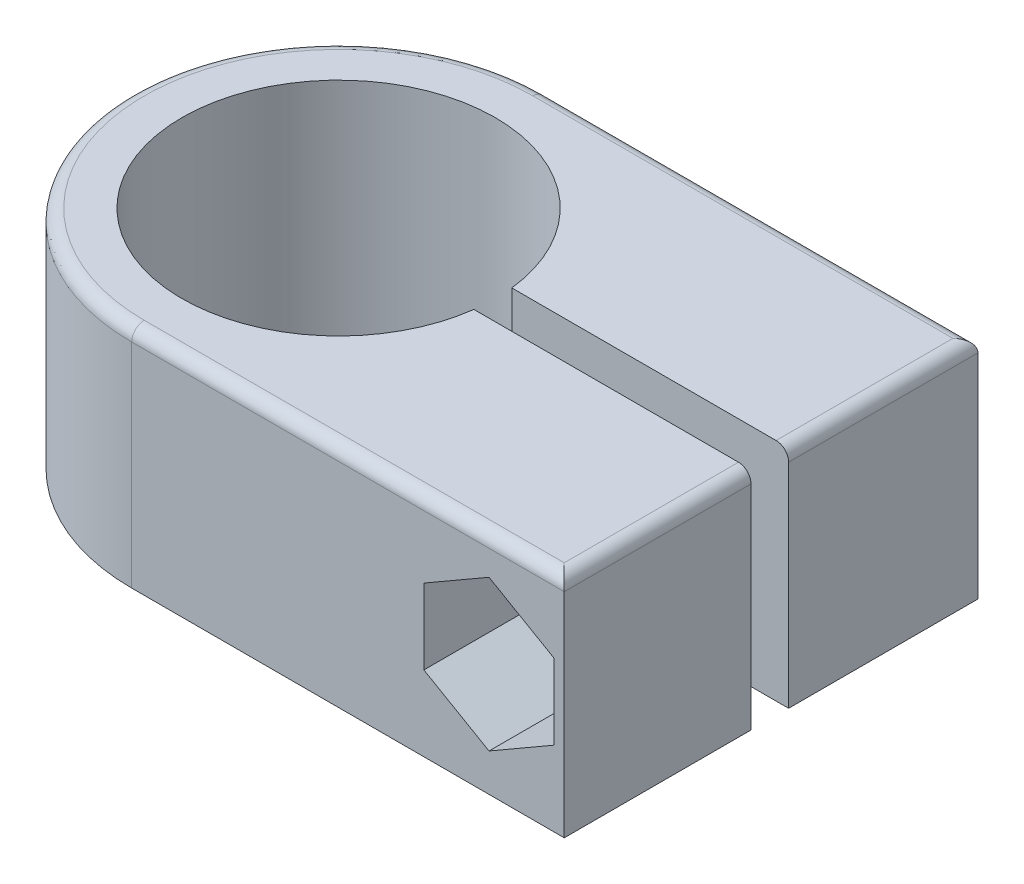
ISO-10303-21;
HEADER;
FILE_DESCRIPTION(('STEP AP214'),'2;1');
FILE_NAME('part.step','',(''),(''),'','','');
FILE_SCHEMA(('AUTOMOTIVE_DESIGN { 1 0 10303 214 1 1 1 1 }'));
ENDSEC;
DATA;
#1=APPLICATION_CONTEXT('core data for automotive mechanical design processes');
#2=APPLICATION_PROTOCOL_DEFINITION('international standard','automotive_design',2000,#1);
#3=PRODUCT_CONTEXT('',#1,'mechanical');
#4=PRODUCT('Part','Part','',(#3));
#5=PRODUCT_RELATED_PRODUCT_CATEGORY('part','',(#4));
#6=PRODUCT_DEFINITION_FORMATION('','',#4);
#7=PRODUCT_DEFINITION_CONTEXT('part definition',#1,'design');
#8=PRODUCT_DEFINITION('design','',#6,#7);
#9=PRODUCT_DEFINITION_SHAPE('','',#8);
#10=(LENGTH_UNIT() NAMED_UNIT(*) SI_UNIT(.MILLI.,.METRE.));
#11=(NAMED_UNIT(*) PLANE_ANGLE_UNIT() SI_UNIT($,.RADIAN.));
#12=(NAMED_UNIT(*) SI_UNIT($,.STERADIAN.) SOLID_ANGLE_UNIT());
#13=UNCERTAINTY_MEASURE_WITH_UNIT(LENGTH_MEASURE(1.E-05),#10,'distance_accuracy_value','');
#14=(GEOMETRIC_REPRESENTATION_CONTEXT(3) GLOBAL_UNCERTAINTY_ASSIGNED_CONTEXT((#13)) GLOBAL_UNIT_ASSIGNED_CONTEXT((#10,
#11,#12)) REPRESENTATION_CONTEXT('',''));
#15=CARTESIAN_POINT('',(0.,0.,0.));
#16=DIRECTION('',(0.,0.,1.));
#17=DIRECTION('',(1.,0.,0.));
#18=AXIS2_PLACEMENT_3D('',#15,#16,#17);
#19=CARTESIAN_POINT('',(0.,18.,16.5));
#20=DIRECTION('',(0.,0.,-1.));
#21=DIRECTION('',(-1.,0.,0.));
#22=AXIS2_PLACEMENT_3D('',#19,#20,#21);
#23=PLANE('',#22);
#24=DIRECTION('',(0.,-1.,0.));
#25=VECTOR('',#24,1.);
#26=CARTESIAN_POINT('',(34.5,18.,16.5));
#27=LINE('',#26,#25);
#28=CARTESIAN_POINT('',(34.5,17.,16.5));
#29=VERTEX_POINT('',#28);
#30=CARTESIAN_POINT('',(34.5,0.,16.5));
#31=VERTEX_POINT('',#30);
#32=EDGE_CURVE('E300',#29,#31,#27,.T.);
#33=ORIENTED_EDGE('',*,*,#32,.F.);
#34=DIRECTION('',(1.,0.,0.));
#35=VECTOR('',#34,1.);
#36=CARTESIAN_POINT('',(0.,17.,16.5));
#37=LINE('',#36,#35);
#38=CARTESIAN_POINT('',(0.,17.,16.5));
#39=VERTEX_POINT('',#38);
#40=EDGE_CURVE('E336',#29,#39,#37,.F.);
#41=ORIENTED_EDGE('',*,*,#40,.T.);
#42=DIRECTION('',(0.,-1.,0.));
#43=VECTOR('',#42,1.);
#44=CARTESIAN_POINT('',(0.,18.,16.5));
#45=LINE('',#44,#43);
#46=CARTESIAN_POINT('',(0.,0.,16.5));
#47=VERTEX_POINT('',#46);
#48=EDGE_CURVE('E302',#39,#47,#45,.T.);
#49=ORIENTED_EDGE('',*,*,#48,.T.);
#50=DIRECTION('',(1.,0.,0.));
#51=VECTOR('',#50,1.);
#52=CARTESIAN_POINT('',(0.,0.,16.5));
#53=LINE('',#52,#51);
#54=EDGE_CURVE('E284',#47,#31,#53,.T.);
#55=ORIENTED_EDGE('',*,*,#54,.T.);
#56=EDGE_LOOP('',(#33,#41,#49,#55));
#57=FACE_BOUND('',#56,.T.);
#58=DIRECTION('',(-0.866025403784438,0.5,0.));
#59=VECTOR('',#58,1.);
#60=CARTESIAN_POINT('',(5.82596189432337,28.0908620039283,16.5));
#61=LINE('',#60,#59);
#62=CARTESIAN_POINT('',(33.6961524227067,12.,16.5));
#63=VERTEX_POINT('',#62);
#64=CARTESIAN_POINT('',(28.5,15.,16.5));
#65=VERTEX_POINT('',#64);
#66=EDGE_CURVE('E363',#63,#65,#61,.T.);
#67=ORIENTED_EDGE('',*,*,#66,.F.);
#68=DIRECTION('',(0.,1.,0.));
#69=VECTOR('',#68,1.);
#70=CARTESIAN_POINT('',(33.6961524227067,18.,16.5));
#71=LINE('',#70,#69);
#72=CARTESIAN_POINT('',(33.6961524227067,5.99999999999997,16.5));
#73=VERTEX_POINT('',#72);
#74=EDGE_CURVE('E353',#73,#63,#71,.T.);
#75=ORIENTED_EDGE('',*,*,#74,.F.);
#76=DIRECTION('',(0.866025403784438,0.5,0.));
#77=VECTOR('',#76,1.);
#78=CARTESIAN_POINT('',(13.6201905283833,-5.59086200392829,16.5));
#79=LINE('',#78,#77);
#80=CARTESIAN_POINT('',(28.5,2.99999999999995,16.5));
#81=VERTEX_POINT('',#80);
#82=EDGE_CURVE('E355',#81,#73,#79,.T.);
#83=ORIENTED_EDGE('',*,*,#82,.F.);
#84=DIRECTION('',(0.866025403784439,-0.5,0.));
#85=VECTOR('',#84,1.);
#86=CARTESIAN_POINT('',(0.629809471616695,19.0908620039282,16.5));
#87=LINE('',#86,#85);
#88=CARTESIAN_POINT('',(23.3038475772933,5.99999999999998,16.5));
#89=VERTEX_POINT('',#88);
#90=EDGE_CURVE('E357',#89,#81,#87,.T.);
#91=ORIENTED_EDGE('',*,*,#90,.F.);
#92=DIRECTION('',(0.,-1.,0.));
#93=VECTOR('',#92,1.);
#94=CARTESIAN_POINT('',(23.3038475772933,18.,16.5));
#95=LINE('',#94,#93);
#96=CARTESIAN_POINT('',(23.3038475772933,12.,16.5));
#97=VERTEX_POINT('',#96);
#98=EDGE_CURVE('E359',#97,#89,#95,.T.);
#99=ORIENTED_EDGE('',*,*,#98,.F.);
#100=DIRECTION('',(-0.866025403784438,-0.5,0.));
#101=VECTOR('',#100,1.);
#102=CARTESIAN_POINT('',(8.42403810567665,3.40913799607178,16.5));
#103=LINE('',#102,#101);
#104=EDGE_CURVE('E361',#65,#97,#103,.T.);
#105=ORIENTED_EDGE('',*,*,#104,.F.);
#106=EDGE_LOOP('',(#67,#75,#83,#91,#99,#105));
#107=FACE_BOUND('',#106,.T.);
#108=ADVANCED_FACE('F38',(#57,#107),#23,.F.);
#109=CARTESIAN_POINT('',(0.,17.,15.5));
#110=DIRECTION('',(-1.,0.,0.));
#111=DIRECTION('',(0.,0.,1.));
#112=AXIS2_PLACEMENT_3D('',#109,#110,#111);
#113=CYLINDRICAL_SURFACE('',#112,1.);
#114=CARTESIAN_POINT('',(33.5,17.,15.5));
#115=DIRECTION('',(-0.707106781186547,0.,0.707106781186548));
#116=DIRECTION('',(0.707106781186548,0.,0.707106781186547));
#117=AXIS2_PLACEMENT_3D('',#114,#115,#116);
#118=ELLIPSE('',#117,1.41421356237309,1.);
#119=CARTESIAN_POINT('',(33.5,18.,15.5));
#120=VERTEX_POINT('',#119);
#121=EDGE_CURVE('E351',#120,#29,#118,.F.);
#122=ORIENTED_EDGE('',*,*,#121,.F.);
#123=DIRECTION('',(1.,0.,0.));
#124=VECTOR('',#123,1.);
#125=CARTESIAN_POINT('',(0.,18.,15.5));
#126=LINE('',#125,#124);
#127=CARTESIAN_POINT('',(0.,18.,15.5));
#128=VERTEX_POINT('',#127);
#129=EDGE_CURVE('E313',#128,#120,#126,.T.);
#130=ORIENTED_EDGE('',*,*,#129,.F.);
#131=CARTESIAN_POINT('',(0.,17.,15.5));
#132=DIRECTION('',(1.,0.,0.));
#133=DIRECTION('',(0.,0.,-1.));
#134=AXIS2_PLACEMENT_3D('',#131,#132,#133);
#135=CIRCLE('',#134,1.);
#136=EDGE_CURVE('E349',#128,#39,#135,.T.);
#137=ORIENTED_EDGE('',*,*,#136,.T.);
#138=ORIENTED_EDGE('',*,*,#40,.F.);
#139=EDGE_LOOP('',(#122,#130,#137,#138));
#140=FACE_BOUND('',#139,.T.);
#141=ADVANCED_FACE('F398',(#140),#113,.T.);
#142=CARTESIAN_POINT('',(0.,17.,0.));
#143=DIRECTION('',(0.,1.,0.));
#144=DIRECTION('',(0.,0.,1.));
#145=AXIS2_PLACEMENT_3D('',#142,#143,#144);
#146=TOROIDAL_SURFACE('',#145,15.5,1.);
#147=ORIENTED_EDGE('',*,*,#136,.F.);
#148=CARTESIAN_POINT('',(0.,18.,0.));
#149=DIRECTION('',(0.,1.,0.));
#150=DIRECTION('',(0.,0.,1.));
#151=AXIS2_PLACEMENT_3D('',#148,#149,#150);
#152=CIRCLE('',#151,15.5);
#153=CARTESIAN_POINT('',(0.,18.,-15.5));
#154=VERTEX_POINT('',#153);
#155=EDGE_CURVE('E316',#154,#128,#152,.T.);
#156=ORIENTED_EDGE('',*,*,#155,.F.);
#157=CARTESIAN_POINT('',(0.,17.,-15.5));
#158=DIRECTION('',(-1.,0.,0.));
#159=DIRECTION('',(0.,0.,1.));
#160=AXIS2_PLACEMENT_3D('',#157,#158,#159);
#161=CIRCLE('',#160,1.);
#162=CARTESIAN_POINT('',(0.,17.,-16.5));
#163=VERTEX_POINT('',#162);
#164=EDGE_CURVE('E347',#154,#163,#161,.T.);
#165=ORIENTED_EDGE('',*,*,#164,.T.);
#166=CARTESIAN_POINT('',(0.,17.,0.));
#167=DIRECTION('',(0.,1.,0.));
#168=DIRECTION('',(0.,0.,1.));
#169=AXIS2_PLACEMENT_3D('',#166,#167,#168);
#170=CIRCLE('',#169,16.5);
#171=EDGE_CURVE('E333',#39,#163,#170,.F.);
#172=ORIENTED_EDGE('',*,*,#171,.F.);
#173=EDGE_LOOP('',(#147,#156,#165,#172));
#174=FACE_BOUND('',#173,.T.);
#175=ADVANCED_FACE('F404',(#174),#146,.T.);
#176=CARTESIAN_POINT('',(0.,17.,-15.5));
#177=DIRECTION('',(1.,0.,0.));
#178=DIRECTION('',(0.,0.,-1.));
#179=AXIS2_PLACEMENT_3D('',#176,#177,#178);
#180=CYLINDRICAL_SURFACE('',#179,1.);
#181=ORIENTED_EDGE('',*,*,#164,.F.);
#182=DIRECTION('',(-1.,0.,0.));
#183=VECTOR('',#182,1.);
#184=CARTESIAN_POINT('',(0.,18.,-15.5));
#185=LINE('',#184,#183);
#186=CARTESIAN_POINT('',(33.5,18.,-15.5));
#187=VERTEX_POINT('',#186);
#188=EDGE_CURVE('E319',#187,#154,#185,.T.);
#189=ORIENTED_EDGE('',*,*,#188,.F.);
#190=CARTESIAN_POINT('',(33.5,17.,-15.5));
#191=DIRECTION('',(0.707106781186547,0.,0.707106781186548));
#192=DIRECTION('',(0.707106781186548,0.,-0.707106781186547));
#193=AXIS2_PLACEMENT_3D('',#190,#191,#192);
#194=ELLIPSE('',#193,1.41421356237309,1.);
#195=CARTESIAN_POINT('',(34.5,17.,-16.5));
#196=VERTEX_POINT('',#195);
#197=EDGE_CURVE('E345',#187,#196,#194,.F.);
#198=ORIENTED_EDGE('',*,*,#197,.T.);
#199=DIRECTION('',(-1.,0.,0.));
#200=VECTOR('',#199,1.);
#201=CARTESIAN_POINT('',(0.,17.,-16.5));
#202=LINE('',#201,#200);
#203=EDGE_CURVE('E330',#163,#196,#202,.F.);
#204=ORIENTED_EDGE('',*,*,#203,.F.);
#205=EDGE_LOOP('',(#181,#189,#198,#204));
#206=FACE_BOUND('',#205,.T.);
#207=ADVANCED_FACE('F429',(#206),#180,.T.);
#208=CARTESIAN_POINT('',(33.5,17.,0.));
#209=DIRECTION('',(0.,0.,1.));
#210=DIRECTION('',(1.,0.,0.));
#211=AXIS2_PLACEMENT_3D('',#208,#209,#210);
#212=CYLINDRICAL_SURFACE('',#211,1.);
#213=ORIENTED_EDGE('',*,*,#197,.F.);
#214=DIRECTION('',(0.,0.,-1.));
#215=VECTOR('',#214,1.);
#216=CARTESIAN_POINT('',(33.5,18.,0.));
#217=LINE('',#216,#215);
#218=CARTESIAN_POINT('',(33.5,18.,-1.39445960097202));
#219=VERTEX_POINT('',#218);
#220=EDGE_CURVE('E322',#219,#187,#217,.T.);
#221=ORIENTED_EDGE('',*,*,#220,.F.);
#222=CARTESIAN_POINT('',(33.5,17.,-1.39445960097202));
#223=DIRECTION('',(0.,0.,-1.));
#224=DIRECTION('',(-1.,0.,0.));
#225=AXIS2_PLACEMENT_3D('',#222,#223,#224);
#226=CIRCLE('',#225,1.);
#227=CARTESIAN_POINT('',(34.5,17.,-1.39445960097202));
#228=VERTEX_POINT('',#227);
#229=EDGE_CURVE('E328',#228,#219,#226,.F.);
#230=ORIENTED_EDGE('',*,*,#229,.F.);
#231=DIRECTION('',(0.,0.,-1.));
#232=VECTOR('',#231,1.);
#233=CARTESIAN_POINT('',(34.5,17.,0.));
#234=LINE('',#233,#232);
#235=EDGE_CURVE('E325',#196,#228,#234,.F.);
#236=ORIENTED_EDGE('',*,*,#235,.F.);
#237=EDGE_LOOP('',(#213,#221,#230,#236));
#238=FACE_BOUND('',#237,.T.);
#239=ADVANCED_FACE('F426',(#238),#212,.T.);
#240=CARTESIAN_POINT('',(33.5,17.,0.));
#241=DIRECTION('',(0.,0.,1.));
#242=DIRECTION('',(1.,0.,0.));
#243=AXIS2_PLACEMENT_3D('',#240,#241,#242);
#244=CYLINDRICAL_SURFACE('',#243,1.);
#245=DIRECTION('',(0.,0.,-1.));
#246=VECTOR('',#245,1.);
#247=CARTESIAN_POINT('',(33.5,18.,0.));
#248=LINE('',#247,#246);
#249=CARTESIAN_POINT('',(33.5,18.,1.60554039902798));
#250=VERTEX_POINT('',#249);
#251=EDGE_CURVE('E310',#120,#250,#248,.T.);
#252=ORIENTED_EDGE('',*,*,#251,.F.);
#253=ORIENTED_EDGE('',*,*,#121,.T.);
#254=DIRECTION('',(0.,0.,-1.));
#255=VECTOR('',#254,1.);
#256=CARTESIAN_POINT('',(34.5,17.,0.));
#257=LINE('',#256,#255);
#258=CARTESIAN_POINT('',(34.5,17.,1.60554039902798));
#259=VERTEX_POINT('',#258);
#260=EDGE_CURVE('E342',#259,#29,#257,.F.);
#261=ORIENTED_EDGE('',*,*,#260,.F.);
#262=CARTESIAN_POINT('',(33.5,17.,1.60554039902798));
#263=DIRECTION('',(0.,0.,1.));
#264=DIRECTION('',(1.,0.,0.));
#265=AXIS2_PLACEMENT_3D('',#262,#263,#264);
#266=CIRCLE('',#265,1.);
#267=EDGE_CURVE('E339',#250,#259,#266,.F.);
#268=ORIENTED_EDGE('',*,*,#267,.F.);
#269=EDGE_LOOP('',(#252,#253,#261,#268));
#270=FACE_BOUND('',#269,.T.);
#271=ADVANCED_FACE('F40',(#270),#244,.T.);
#272=CARTESIAN_POINT('',(12.4219757857298,18.,-1.39445960097202));
#273=DIRECTION('',(0.,0.,-1.));
#274=DIRECTION('',(-1.,0.,0.));
#275=AXIS2_PLACEMENT_3D('',#272,#273,#274);
#276=PLANE('',#275);
#277=DIRECTION('',(0.,-1.,0.));
#278=VECTOR('',#277,1.);
#279=CARTESIAN_POINT('',(34.5,18.,-1.39445960097202));
#280=LINE('',#279,#278);
#281=CARTESIAN_POINT('',(34.5,0.,-1.39445960097202));
#282=VERTEX_POINT('',#281);
#283=EDGE_CURVE('E308',#228,#282,#280,.T.);
#284=ORIENTED_EDGE('',*,*,#283,.F.);
#285=ORIENTED_EDGE('',*,*,#229,.T.);
#286=DIRECTION('',(1.,0.,0.));
#287=VECTOR('',#286,1.);
#288=CARTESIAN_POINT('',(12.4219757857298,18.,-1.39445960097202));
#289=LINE('',#288,#287);
#290=CARTESIAN_POINT('',(12.4219757857298,18.,-1.39445960097202));
#291=VERTEX_POINT('',#290);
#292=EDGE_CURVE('E264',#291,#219,#289,.T.);
#293=ORIENTED_EDGE('',*,*,#292,.F.);
#294=DIRECTION('',(0.,-1.,0.));
#295=VECTOR('',#294,1.);
#296=CARTESIAN_POINT('',(12.4219757857298,18.,-1.39445960097202));
#297=LINE('',#296,#295);
#298=CARTESIAN_POINT('',(12.4219757857298,0.,-1.39445960097202));
#299=VERTEX_POINT('',#298);
#300=EDGE_CURVE('E272',#291,#299,#297,.T.);
#301=ORIENTED_EDGE('',*,*,#300,.T.);
#302=DIRECTION('',(1.,0.,0.));
#303=VECTOR('',#302,1.);
#304=CARTESIAN_POINT('',(12.4219757857298,0.,-1.39445960097202));
#305=LINE('',#304,#303);
#306=EDGE_CURVE('E263',#299,#282,#305,.T.);
#307=ORIENTED_EDGE('',*,*,#306,.T.);
#308=EDGE_LOOP('',(#284,#285,#293,#301,#307));
#309=FACE_BOUND('',#308,.T.);
#310=ADVANCED_FACE('F421',(#309),#276,.F.);
#311=CARTESIAN_POINT('',(34.5,18.,-1.39445960097202));
#312=DIRECTION('',(-1.,0.,0.));
#313=DIRECTION('',(0.,0.,1.));
#314=AXIS2_PLACEMENT_3D('',#311,#312,#313);
#315=PLANE('',#314);
#316=DIRECTION('',(0.,-1.,0.));
#317=VECTOR('',#316,1.);
#318=CARTESIAN_POINT('',(34.5,18.,-16.5));
#319=LINE('',#318,#317);
#320=CARTESIAN_POINT('',(34.5,0.,-16.5));
#321=VERTEX_POINT('',#320);
#322=EDGE_CURVE('E306',#196,#321,#319,.T.);
#323=ORIENTED_EDGE('',*,*,#322,.F.);
#324=ORIENTED_EDGE('',*,*,#235,.T.);
#325=ORIENTED_EDGE('',*,*,#283,.T.);
#326=DIRECTION('',(0.,0.,-1.));
#327=VECTOR('',#326,1.);
#328=CARTESIAN_POINT('',(34.5,0.,-1.39445960097202));
#329=LINE('',#328,#327);
#330=EDGE_CURVE('E275',#282,#321,#329,.T.);
#331=ORIENTED_EDGE('',*,*,#330,.T.);
#332=EDGE_LOOP('',(#323,#324,#325,#331));
#333=FACE_BOUND('',#332,.T.);
#334=ADVANCED_FACE('F418',(#333),#315,.F.);
#335=CARTESIAN_POINT('',(0.,18.,-16.5));
#336=DIRECTION('',(0.,0.,1.));
#337=DIRECTION('',(1.,0.,0.));
#338=AXIS2_PLACEMENT_3D('',#335,#336,#337);
#339=PLANE('',#338);
#340=DIRECTION('',(0.,1.,0.));
#341=VECTOR('',#340,1.);
#342=CARTESIAN_POINT('',(33.6961524227067,18.,-16.5));
#343=LINE('',#342,#341);
#344=CARTESIAN_POINT('',(33.6961524227067,5.99999999999997,-16.5));
#345=VERTEX_POINT('',#344);
#346=CARTESIAN_POINT('',(33.6961524227067,12.,-16.5));
#347=VERTEX_POINT('',#346);
#348=EDGE_CURVE('E46',#345,#347,#343,.T.);
#349=ORIENTED_EDGE('',*,*,#348,.T.);
#350=DIRECTION('',(-0.866025403784438,0.5,0.));
#351=VECTOR('',#350,1.);
#352=CARTESIAN_POINT('',(5.82596189432337,28.0908620039283,-16.5));
#353=LINE('',#352,#351);
#354=CARTESIAN_POINT('',(28.5,15.,-16.5));
#355=VERTEX_POINT('',#354);
#356=EDGE_CURVE('E11',#347,#355,#353,.T.);
#357=ORIENTED_EDGE('',*,*,#356,.T.);
#358=DIRECTION('',(-0.866025403784438,-0.5,0.));
#359=VECTOR('',#358,1.);
#360=CARTESIAN_POINT('',(8.42403810567665,3.40913799607178,-16.5));
#361=LINE('',#360,#359);
#362=CARTESIAN_POINT('',(23.3038475772933,12.,-16.5));
#363=VERTEX_POINT('',#362);
#364=EDGE_CURVE('E365',#355,#363,#361,.T.);
#365=ORIENTED_EDGE('',*,*,#364,.T.);
#366=DIRECTION('',(0.,-1.,0.));
#367=VECTOR('',#366,1.);
#368=CARTESIAN_POINT('',(23.3038475772933,18.,-16.5));
#369=LINE('',#368,#367);
#370=CARTESIAN_POINT('',(23.3038475772933,5.99999999999998,-16.5));
#371=VERTEX_POINT('',#370);
#372=EDGE_CURVE('E368',#363,#371,#369,.T.);
#373=ORIENTED_EDGE('',*,*,#372,.T.);
#374=DIRECTION('',(0.866025403784439,-0.5,0.));
#375=VECTOR('',#374,1.);
#376=CARTESIAN_POINT('',(0.629809471616695,19.0908620039282,-16.5));
#377=LINE('',#376,#375);
#378=CARTESIAN_POINT('',(28.5,2.99999999999995,-16.5));
#379=VERTEX_POINT('',#378);
#380=EDGE_CURVE('E371',#371,#379,#377,.T.);
#381=ORIENTED_EDGE('',*,*,#380,.T.);
#382=DIRECTION('',(0.866025403784438,0.5,0.));
#383=VECTOR('',#382,1.);
#384=CARTESIAN_POINT('',(13.6201905283833,-5.59086200392829,-16.5));
#385=LINE('',#384,#383);
#386=EDGE_CURVE('E374',#379,#345,#385,.T.);
#387=ORIENTED_EDGE('',*,*,#386,.T.);
#388=EDGE_LOOP('',(#349,#357,#365,#373,#381,#387));
#389=FACE_BOUND('',#388,.T.);
#390=DIRECTION('',(0.,-1.,0.));
#391=VECTOR('',#390,1.);
#392=CARTESIAN_POINT('',(0.,18.,-16.5));
#393=LINE('',#392,#391);
#394=CARTESIAN_POINT('',(0.,0.,-16.5));
#395=VERTEX_POINT('',#394);
#396=EDGE_CURVE('E304',#163,#395,#393,.T.);
#397=ORIENTED_EDGE('',*,*,#396,.F.);
#398=ORIENTED_EDGE('',*,*,#203,.T.);
#399=ORIENTED_EDGE('',*,*,#322,.T.);
#400=DIRECTION('',(-1.,0.,0.));
#401=VECTOR('',#400,1.);
#402=CARTESIAN_POINT('',(0.,0.,-16.5));
#403=LINE('',#402,#401);
#404=EDGE_CURVE('E278',#321,#395,#403,.T.);
#405=ORIENTED_EDGE('',*,*,#404,.T.);
#406=EDGE_LOOP('',(#397,#398,#399,#405));
#407=FACE_BOUND('',#406,.T.);
#408=ADVANCED_FACE('F377',(#389,#407),#339,.F.);
#409=CARTESIAN_POINT('',(0.,18.,0.));
#410=DIRECTION('',(0.,-1.,0.));
#411=DIRECTION('',(0.,0.,-1.));
#412=AXIS2_PLACEMENT_3D('',#409,#410,#411);
#413=CYLINDRICAL_SURFACE('',#412,16.5);
#414=ORIENTED_EDGE('',*,*,#48,.F.);
#415=ORIENTED_EDGE('',*,*,#171,.T.);
#416=ORIENTED_EDGE('',*,*,#396,.T.);
#417=CARTESIAN_POINT('',(0.,0.,0.));
#418=DIRECTION('',(0.,1.,0.));
#419=DIRECTION('',(0.,0.,1.));
#420=AXIS2_PLACEMENT_3D('',#417,#418,#419);
#421=CIRCLE('',#420,16.5);
#422=EDGE_CURVE('E281',#395,#47,#421,.T.);
#423=ORIENTED_EDGE('',*,*,#422,.T.);
#424=EDGE_LOOP('',(#414,#415,#416,#423));
#425=FACE_BOUND('',#424,.T.);
#426=ADVANCED_FACE('F412',(#425),#413,.T.);
#427=CARTESIAN_POINT('',(34.5,18.,16.5));
#428=DIRECTION('',(-1.,0.,0.));
#429=DIRECTION('',(0.,0.,1.));
#430=AXIS2_PLACEMENT_3D('',#427,#428,#429);
#431=PLANE('',#430);
#432=DIRECTION('',(0.,-1.,0.));
#433=VECTOR('',#432,1.);
#434=CARTESIAN_POINT('',(34.5,18.,1.60554039902798));
#435=LINE('',#434,#433);
#436=CARTESIAN_POINT('',(34.5,0.,1.60554039902798));
#437=VERTEX_POINT('',#436);
#438=EDGE_CURVE('E298',#259,#437,#435,.T.);
#439=ORIENTED_EDGE('',*,*,#438,.F.);
#440=ORIENTED_EDGE('',*,*,#260,.T.);
#441=ORIENTED_EDGE('',*,*,#32,.T.);
#442=DIRECTION('',(0.,0.,-1.));
#443=VECTOR('',#442,1.);
#444=CARTESIAN_POINT('',(34.5,0.,16.5));
#445=LINE('',#444,#443);
#446=EDGE_CURVE('E287',#31,#437,#445,.T.);
#447=ORIENTED_EDGE('',*,*,#446,.T.);
#448=EDGE_LOOP('',(#439,#440,#441,#447));
#449=FACE_BOUND('',#448,.T.);
#450=ADVANCED_FACE('F410',(#449),#431,.F.);
#451=CARTESIAN_POINT('',(12.3964607863329,18.,1.60554039902798));
#452=DIRECTION('',(0.,0.,1.));
#453=DIRECTION('',(1.,0.,0.));
#454=AXIS2_PLACEMENT_3D('',#451,#452,#453);
#455=PLANE('',#454);
#456=DIRECTION('',(-1.,0.,0.));
#457=VECTOR('',#456,1.);
#458=CARTESIAN_POINT('',(12.3964607863329,18.,1.60554039902798));
#459=LINE('',#458,#457);
#460=CARTESIAN_POINT('',(12.3964607863329,18.,1.60554039902798));
#461=VERTEX_POINT('',#460);
#462=EDGE_CURVE('E267',#250,#461,#459,.T.);
#463=ORIENTED_EDGE('',*,*,#462,.F.);
#464=ORIENTED_EDGE('',*,*,#267,.T.);
#465=ORIENTED_EDGE('',*,*,#438,.T.);
#466=DIRECTION('',(-1.,0.,0.));
#467=VECTOR('',#466,1.);
#468=CARTESIAN_POINT('',(12.3964607863329,0.,1.60554039902798));
#469=LINE('',#468,#467);
#470=CARTESIAN_POINT('',(12.3964607863329,0.,1.60554039902798));
#471=VERTEX_POINT('',#470);
#472=EDGE_CURVE('E290',#437,#471,#469,.T.);
#473=ORIENTED_EDGE('',*,*,#472,.T.);
#474=DIRECTION('',(0.,-1.,0.));
#475=VECTOR('',#474,1.);
#476=CARTESIAN_POINT('',(12.3964607863329,18.,1.60554039902798));
#477=LINE('',#476,#475);
#478=EDGE_CURVE('E295',#461,#471,#477,.T.);
#479=ORIENTED_EDGE('',*,*,#478,.F.);
#480=EDGE_LOOP('',(#463,#464,#465,#473,#479));
#481=FACE_BOUND('',#480,.T.);
#482=ADVANCED_FACE('F454',(#481),#455,.F.);
#483=CARTESIAN_POINT('',(0.,18.,0.));
#484=DIRECTION('',(0.,-1.,0.));
#485=DIRECTION('',(0.,0.,-1.));
#486=AXIS2_PLACEMENT_3D('',#483,#484,#485);
#487=CYLINDRICAL_SURFACE('',#486,12.5);
#488=CARTESIAN_POINT('',(0.,0.,0.));
#489=DIRECTION('',(0.,-1.,0.));
#490=DIRECTION('',(0.,0.,1.));
#491=AXIS2_PLACEMENT_3D('',#488,#489,#490);
#492=CIRCLE('',#491,12.5);
#493=EDGE_CURVE('E268',#471,#299,#492,.T.);
#494=ORIENTED_EDGE('',*,*,#493,.T.);
#495=ORIENTED_EDGE('',*,*,#300,.F.);
#496=CARTESIAN_POINT('',(0.,18.,0.));
#497=DIRECTION('',(0.,-1.,0.));
#498=DIRECTION('',(0.,0.,1.));
#499=AXIS2_PLACEMENT_3D('',#496,#497,#498);
#500=CIRCLE('',#499,12.5);
#501=EDGE_CURVE('E270',#461,#291,#500,.T.);
#502=ORIENTED_EDGE('',*,*,#501,.F.);
#503=ORIENTED_EDGE('',*,*,#478,.T.);
#504=EDGE_LOOP('',(#494,#495,#502,#503));
#505=FACE_BOUND('',#504,.T.);
#506=ADVANCED_FACE('F460',(#505),#487,.F.);
#507=CARTESIAN_POINT('',(0.,18.,0.));
#508=DIRECTION('',(0.,1.,0.));
#509=DIRECTION('',(0.,0.,1.));
#510=AXIS2_PLACEMENT_3D('',#507,#508,#509);
#511=PLANE('',#510);
#512=ORIENTED_EDGE('',*,*,#292,.T.);
#513=ORIENTED_EDGE('',*,*,#220,.T.);
#514=ORIENTED_EDGE('',*,*,#188,.T.);
#515=ORIENTED_EDGE('',*,*,#155,.T.);
#516=ORIENTED_EDGE('',*,*,#129,.T.);
#517=ORIENTED_EDGE('',*,*,#251,.T.);
#518=ORIENTED_EDGE('',*,*,#462,.T.);
#519=ORIENTED_EDGE('',*,*,#501,.T.);
#520=EDGE_LOOP('',(#512,#513,#514,#515,#516,#517,#518,#519));
#521=FACE_BOUND('',#520,.T.);
#522=ADVANCED_FACE('F444',(#521),#511,.T.);
#523=CARTESIAN_POINT('',(0.,0.,0.));
#524=DIRECTION('',(0.,1.,0.));
#525=DIRECTION('',(0.,0.,1.));
#526=AXIS2_PLACEMENT_3D('',#523,#524,#525);
#527=PLANE('',#526);
#528=ORIENTED_EDGE('',*,*,#306,.F.);
#529=ORIENTED_EDGE('',*,*,#493,.F.);
#530=ORIENTED_EDGE('',*,*,#472,.F.);
#531=ORIENTED_EDGE('',*,*,#446,.F.);
#532=ORIENTED_EDGE('',*,*,#54,.F.);
#533=ORIENTED_EDGE('',*,*,#422,.F.);
#534=ORIENTED_EDGE('',*,*,#404,.F.);
#535=ORIENTED_EDGE('',*,*,#330,.F.);
#536=EDGE_LOOP('',(#528,#529,#530,#531,#532,#533,#534,#535));
#537=FACE_BOUND('',#536,.T.);
#538=ADVANCED_FACE('F470',(#537),#527,.F.);
#539=CARTESIAN_POINT('',(33.6961524227067,12.,16.500012));
#540=DIRECTION('',(-0.5,-0.866025403784438,0.));
#541=DIRECTION('',(0.866025403784438,-0.5,0.));
#542=AXIS2_PLACEMENT_3D('',#539,#540,#541);
#543=PLANE('',#542);
#544=ORIENTED_EDGE('',*,*,#66,.T.);
#545=DIRECTION('',(0.,0.,-1.));
#546=VECTOR('',#545,1.);
#547=CARTESIAN_POINT('',(28.5,15.,16.500012));
#548=LINE('',#547,#546);
#549=CARTESIAN_POINT('',(28.5,15.,6.5));
#550=VERTEX_POINT('',#549);
#551=EDGE_CURVE('E261',#65,#550,#548,.T.);
#552=ORIENTED_EDGE('',*,*,#551,.T.);
#553=DIRECTION('',(-0.866025403784438,0.5,0.));
#554=VECTOR('',#553,1.);
#555=CARTESIAN_POINT('',(33.6961524227067,12.,6.5));
#556=LINE('',#555,#554);
#557=CARTESIAN_POINT('',(33.6961524227067,12.,6.5));
#558=VERTEX_POINT('',#557);
#559=EDGE_CURVE('E201',#558,#550,#556,.T.);
#560=ORIENTED_EDGE('',*,*,#559,.F.);
#561=DIRECTION('',(0.,0.,-1.));
#562=VECTOR('',#561,1.);
#563=CARTESIAN_POINT('',(33.6961524227067,12.,16.500012));
#564=LINE('',#563,#562);
#565=EDGE_CURVE('E252',#63,#558,#564,.T.);
#566=ORIENTED_EDGE('',*,*,#565,.F.);
#567=EDGE_LOOP('',(#544,#552,#560,#566));
#568=FACE_BOUND('',#567,.T.);
#569=ADVANCED_FACE('F476',(#568),#543,.T.);
#570=CARTESIAN_POINT('',(28.5,15.,16.500012));
#571=DIRECTION('',(0.5,-0.866025403784438,0.));
#572=DIRECTION('',(0.866025403784438,0.5,0.));
#573=AXIS2_PLACEMENT_3D('',#570,#571,#572);
#574=PLANE('',#573);
#575=ORIENTED_EDGE('',*,*,#104,.T.);
#576=DIRECTION('',(0.,0.,-1.));
#577=VECTOR('',#576,1.);
#578=CARTESIAN_POINT('',(23.3038475772933,12.,16.500012));
#579=LINE('',#578,#577);
#580=CARTESIAN_POINT('',(23.3038475772933,12.,6.5));
#581=VERTEX_POINT('',#580);
#582=EDGE_CURVE('E259',#97,#581,#579,.T.);
#583=ORIENTED_EDGE('',*,*,#582,.T.);
#584=DIRECTION('',(-0.866025403784438,-0.5,0.));
#585=VECTOR('',#584,1.);
#586=CARTESIAN_POINT('',(28.5,15.,6.5));
#587=LINE('',#586,#585);
#588=EDGE_CURVE('E237',#550,#581,#587,.T.);
#589=ORIENTED_EDGE('',*,*,#588,.F.);
#590=ORIENTED_EDGE('',*,*,#551,.F.);
#591=EDGE_LOOP('',(#575,#583,#589,#590));
#592=FACE_BOUND('',#591,.T.);
#593=ADVANCED_FACE('F482',(#592),#574,.T.);
#594=CARTESIAN_POINT('',(23.3038475772933,12.,16.500012));
#595=DIRECTION('',(1.,0.,0.));
#596=DIRECTION('',(0.,0.,-1.));
#597=AXIS2_PLACEMENT_3D('',#594,#595,#596);
#598=PLANE('',#597);
#599=ORIENTED_EDGE('',*,*,#98,.T.);
#600=DIRECTION('',(0.,0.,-1.));
#601=VECTOR('',#600,1.);
#602=CARTESIAN_POINT('',(23.3038475772933,5.99999999999998,16.500012));
#603=LINE('',#602,#601);
#604=CARTESIAN_POINT('',(23.3038475772933,5.99999999999998,6.5));
#605=VERTEX_POINT('',#604);
#606=EDGE_CURVE('E257',#89,#605,#603,.T.);
#607=ORIENTED_EDGE('',*,*,#606,.T.);
#608=DIRECTION('',(0.,-1.,0.));
#609=VECTOR('',#608,1.);
#610=CARTESIAN_POINT('',(23.3038475772933,12.,6.5));
#611=LINE('',#610,#609);
#612=EDGE_CURVE('E240',#581,#605,#611,.T.);
#613=ORIENTED_EDGE('',*,*,#612,.F.);
#614=ORIENTED_EDGE('',*,*,#582,.F.);
#615=EDGE_LOOP('',(#599,#607,#613,#614));
#616=FACE_BOUND('',#615,.T.);
#617=ADVANCED_FACE('F580',(#616),#598,.T.);
#618=CARTESIAN_POINT('',(23.3038475772933,5.99999999999998,16.500012));
#619=DIRECTION('',(0.5,0.866025403784439,0.));
#620=DIRECTION('',(-0.866025403784439,0.5,0.));
#621=AXIS2_PLACEMENT_3D('',#618,#619,#620);
#622=PLANE('',#621);
#623=ORIENTED_EDGE('',*,*,#90,.T.);
#624=DIRECTION('',(0.,0.,-1.));
#625=VECTOR('',#624,1.);
#626=CARTESIAN_POINT('',(28.5,2.99999999999995,16.500012));
#627=LINE('',#626,#625);
#628=CARTESIAN_POINT('',(28.5,2.99999999999995,6.5));
#629=VERTEX_POINT('',#628);
#630=EDGE_CURVE('E255',#81,#629,#627,.T.);
#631=ORIENTED_EDGE('',*,*,#630,.T.);
#632=DIRECTION('',(0.866025403784439,-0.5,0.));
#633=VECTOR('',#632,1.);
#634=CARTESIAN_POINT('',(23.3038475772933,5.99999999999998,6.5));
#635=LINE('',#634,#633);
#636=EDGE_CURVE('E243',#605,#629,#635,.T.);
#637=ORIENTED_EDGE('',*,*,#636,.F.);
#638=ORIENTED_EDGE('',*,*,#606,.F.);
#639=EDGE_LOOP('',(#623,#631,#637,#638));
#640=FACE_BOUND('',#639,.T.);
#641=ADVANCED_FACE('F591',(#640),#622,.T.);
#642=CARTESIAN_POINT('',(28.5,2.99999999999995,16.500012));
#643=DIRECTION('',(-0.5,0.866025403784438,0.));
#644=DIRECTION('',(-0.866025403784438,-0.5,0.));
#645=AXIS2_PLACEMENT_3D('',#642,#643,#644);
#646=PLANE('',#645);
#647=ORIENTED_EDGE('',*,*,#82,.T.);
#648=DIRECTION('',(0.,0.,-1.));
#649=VECTOR('',#648,1.);
#650=CARTESIAN_POINT('',(33.6961524227067,5.99999999999997,16.500012));
#651=LINE('',#650,#649);
#652=CARTESIAN_POINT('',(33.6961524227067,5.99999999999997,6.5));
#653=VERTEX_POINT('',#652);
#654=EDGE_CURVE('E61',#73,#653,#651,.T.);
#655=ORIENTED_EDGE('',*,*,#654,.T.);
#656=DIRECTION('',(0.866025403784438,0.5,0.));
#657=VECTOR('',#656,1.);
#658=CARTESIAN_POINT('',(28.5,2.99999999999995,6.5));
#659=LINE('',#658,#657);
#660=EDGE_CURVE('E246',#629,#653,#659,.T.);
#661=ORIENTED_EDGE('',*,*,#660,.F.);
#662=ORIENTED_EDGE('',*,*,#630,.F.);
#663=EDGE_LOOP('',(#647,#655,#661,#662));
#664=FACE_BOUND('',#663,.T.);
#665=ADVANCED_FACE('F602',(#664),#646,.T.);
#666=CARTESIAN_POINT('',(33.6961524227067,5.99999999999997,16.500012));
#667=DIRECTION('',(-1.,0.,0.));
#668=DIRECTION('',(0.,0.,1.));
#669=AXIS2_PLACEMENT_3D('',#666,#667,#668);
#670=PLANE('',#669);
#671=ORIENTED_EDGE('',*,*,#74,.T.);
#672=ORIENTED_EDGE('',*,*,#565,.T.);
#673=DIRECTION('',(0.,1.,0.));
#674=VECTOR('',#673,1.);
#675=CARTESIAN_POINT('',(33.6961524227067,5.99999999999997,6.5));
#676=LINE('',#675,#674);
#677=EDGE_CURVE('E249',#653,#558,#676,.T.);
#678=ORIENTED_EDGE('',*,*,#677,.F.);
#679=ORIENTED_EDGE('',*,*,#654,.F.);
#680=EDGE_LOOP('',(#671,#672,#678,#679));
#681=FACE_BOUND('',#680,.T.);
#682=ADVANCED_FACE('F613',(#681),#670,.T.);
#683=CARTESIAN_POINT('',(0.,0.,6.5));
#684=DIRECTION('',(0.,0.,1.));
#685=DIRECTION('',(1.,0.,0.));
#686=AXIS2_PLACEMENT_3D('',#683,#684,#685);
#687=PLANE('',#686);
#688=ORIENTED_EDGE('',*,*,#559,.T.);
#689=ORIENTED_EDGE('',*,*,#588,.T.);
#690=ORIENTED_EDGE('',*,*,#612,.T.);
#691=ORIENTED_EDGE('',*,*,#636,.T.);
#692=ORIENTED_EDGE('',*,*,#660,.T.);
#693=ORIENTED_EDGE('',*,*,#677,.T.);
#694=EDGE_LOOP('',(#688,#689,#690,#691,#692,#693));
#695=FACE_BOUND('',#694,.T.);
#696=ADVANCED_FACE('F623',(#695),#687,.T.);
#697=CARTESIAN_POINT('',(33.6961524227067,12.,-16.500012));
#698=DIRECTION('',(0.5,0.866025403784438,0.));
#699=DIRECTION('',(-0.866025403784438,0.5,0.));
#700=AXIS2_PLACEMENT_3D('',#697,#698,#699);
#701=PLANE('',#700);
#702=DIRECTION('',(0.,0.,1.));
#703=VECTOR('',#702,1.);
#704=CARTESIAN_POINT('',(33.6961524227067,12.,-16.500012));
#705=LINE('',#704,#703);
#706=CARTESIAN_POINT('',(33.6961524227067,12.,-6.5));
#707=VERTEX_POINT('',#706);
#708=EDGE_CURVE('E193',#347,#707,#705,.T.);
#709=ORIENTED_EDGE('',*,*,#708,.T.);
#710=DIRECTION('',(-0.866025403784438,0.5,0.));
#711=VECTOR('',#710,1.);
#712=CARTESIAN_POINT('',(33.6961524227067,12.,-6.5));
#713=LINE('',#712,#711);
#714=CARTESIAN_POINT('',(28.5,15.,-6.5));
#715=VERTEX_POINT('',#714);
#716=EDGE_CURVE('E198',#707,#715,#713,.T.);
#717=ORIENTED_EDGE('',*,*,#716,.T.);
#718=DIRECTION('',(0.,0.,1.));
#719=VECTOR('',#718,1.);
#720=CARTESIAN_POINT('',(28.5,15.,-16.500012));
#721=LINE('',#720,#719);
#722=EDGE_CURVE('E227',#355,#715,#721,.T.);
#723=ORIENTED_EDGE('',*,*,#722,.F.);
#724=ORIENTED_EDGE('',*,*,#356,.F.);
#725=EDGE_LOOP('',(#709,#717,#723,#724));
#726=FACE_BOUND('',#725,.T.);
#727=ADVANCED_FACE('F195',(#726),#701,.F.);
#728=CARTESIAN_POINT('',(33.6961524227067,5.99999999999997,-16.500012));
#729=DIRECTION('',(1.,0.,0.));
#730=DIRECTION('',(0.,0.,-1.));
#731=AXIS2_PLACEMENT_3D('',#728,#729,#730);
#732=PLANE('',#731);
#733=DIRECTION('',(0.,0.,1.));
#734=VECTOR('',#733,1.);
#735=CARTESIAN_POINT('',(33.6961524227067,5.99999999999997,-16.500012));
#736=LINE('',#735,#734);
#737=CARTESIAN_POINT('',(33.6961524227067,5.99999999999997,-6.5));
#738=VERTEX_POINT('',#737);
#739=EDGE_CURVE('E202',#345,#738,#736,.T.);
#740=ORIENTED_EDGE('',*,*,#739,.T.);
#741=DIRECTION('',(0.,1.,0.));
#742=VECTOR('',#741,1.);
#743=CARTESIAN_POINT('',(33.6961524227067,5.99999999999997,-6.5));
#744=LINE('',#743,#742);
#745=EDGE_CURVE('E205',#738,#707,#744,.T.);
#746=ORIENTED_EDGE('',*,*,#745,.T.);
#747=ORIENTED_EDGE('',*,*,#708,.F.);
#748=ORIENTED_EDGE('',*,*,#348,.F.);
#749=EDGE_LOOP('',(#740,#746,#747,#748));
#750=FACE_BOUND('',#749,.T.);
#751=ADVANCED_FACE('F206',(#750),#732,.F.);
#752=CARTESIAN_POINT('',(28.5,2.99999999999995,-16.500012));
#753=DIRECTION('',(0.5,-0.866025403784438,0.));
#754=DIRECTION('',(0.866025403784438,0.5,0.));
#755=AXIS2_PLACEMENT_3D('',#752,#753,#754);
#756=PLANE('',#755);
#757=DIRECTION('',(0.,0.,1.));
#758=VECTOR('',#757,1.);
#759=CARTESIAN_POINT('',(28.5,2.99999999999995,-16.500012));
#760=LINE('',#759,#758);
#761=CARTESIAN_POINT('',(28.5,2.99999999999995,-6.5));
#762=VERTEX_POINT('',#761);
#763=EDGE_CURVE('E232',#379,#762,#760,.T.);
#764=ORIENTED_EDGE('',*,*,#763,.T.);
#765=DIRECTION('',(0.866025403784438,0.5,0.));
#766=VECTOR('',#765,1.);
#767=CARTESIAN_POINT('',(28.5,2.99999999999995,-6.5));
#768=LINE('',#767,#766);
#769=EDGE_CURVE('E211',#762,#738,#768,.T.);
#770=ORIENTED_EDGE('',*,*,#769,.T.);
#771=ORIENTED_EDGE('',*,*,#739,.F.);
#772=ORIENTED_EDGE('',*,*,#386,.F.);
#773=EDGE_LOOP('',(#764,#770,#771,#772));
#774=FACE_BOUND('',#773,.T.);
#775=ADVANCED_FACE('F380',(#774),#756,.F.);
#776=CARTESIAN_POINT('',(23.3038475772933,5.99999999999998,-16.500012));
#777=DIRECTION('',(-0.5,-0.866025403784439,0.));
#778=DIRECTION('',(0.866025403784439,-0.5,0.));
#779=AXIS2_PLACEMENT_3D('',#776,#777,#778);
#780=PLANE('',#779);
#781=DIRECTION('',(0.,0.,1.));
#782=VECTOR('',#781,1.);
#783=CARTESIAN_POINT('',(23.3038475772933,5.99999999999998,-16.500012));
#784=LINE('',#783,#782);
#785=CARTESIAN_POINT('',(23.3038475772933,5.99999999999998,-6.5));
#786=VERTEX_POINT('',#785);
#787=EDGE_CURVE('E230',#371,#786,#784,.T.);
#788=ORIENTED_EDGE('',*,*,#787,.T.);
#789=DIRECTION('',(0.866025403784439,-0.5,0.));
#790=VECTOR('',#789,1.);
#791=CARTESIAN_POINT('',(23.3038475772933,5.99999999999998,-6.5));
#792=LINE('',#791,#790);
#793=EDGE_CURVE('E220',#786,#762,#792,.T.);
#794=ORIENTED_EDGE('',*,*,#793,.T.);
#795=ORIENTED_EDGE('',*,*,#763,.F.);
#796=ORIENTED_EDGE('',*,*,#380,.F.);
#797=EDGE_LOOP('',(#788,#794,#795,#796));
#798=FACE_BOUND('',#797,.T.);
#799=ADVANCED_FACE('F384',(#798),#780,.F.);
#800=CARTESIAN_POINT('',(23.3038475772933,12.,-16.500012));
#801=DIRECTION('',(-1.,0.,0.));
#802=DIRECTION('',(0.,0.,1.));
#803=AXIS2_PLACEMENT_3D('',#800,#801,#802);
#804=PLANE('',#803);
#805=DIRECTION('',(0.,0.,1.));
#806=VECTOR('',#805,1.);
#807=CARTESIAN_POINT('',(23.3038475772933,12.,-16.500012));
#808=LINE('',#807,#806);
#809=CARTESIAN_POINT('',(23.3038475772933,12.,-6.5));
#810=VERTEX_POINT('',#809);
#811=EDGE_CURVE('E53',#363,#810,#808,.T.);
#812=ORIENTED_EDGE('',*,*,#811,.T.);
#813=DIRECTION('',(0.,-1.,0.));
#814=VECTOR('',#813,1.);
#815=CARTESIAN_POINT('',(23.3038475772933,12.,-6.5));
#816=LINE('',#815,#814);
#817=EDGE_CURVE('E223',#810,#786,#816,.T.);
#818=ORIENTED_EDGE('',*,*,#817,.T.);
#819=ORIENTED_EDGE('',*,*,#787,.F.);
#820=ORIENTED_EDGE('',*,*,#372,.F.);
#821=EDGE_LOOP('',(#812,#818,#819,#820));
#822=FACE_BOUND('',#821,.T.);
#823=ADVANCED_FACE('F387',(#822),#804,.F.);
#824=CARTESIAN_POINT('',(28.5,15.,-16.500012));
#825=DIRECTION('',(-0.5,0.866025403784438,0.));
#826=DIRECTION('',(-0.866025403784438,-0.5,0.));
#827=AXIS2_PLACEMENT_3D('',#824,#825,#826);
#828=PLANE('',#827);
#829=ORIENTED_EDGE('',*,*,#722,.T.);
#830=DIRECTION('',(-0.866025403784438,-0.5,0.));
#831=VECTOR('',#830,1.);
#832=CARTESIAN_POINT('',(28.5,15.,-6.5));
#833=LINE('',#832,#831);
#834=EDGE_CURVE('E216',#715,#810,#833,.T.);
#835=ORIENTED_EDGE('',*,*,#834,.T.);
#836=ORIENTED_EDGE('',*,*,#811,.F.);
#837=ORIENTED_EDGE('',*,*,#364,.F.);
#838=EDGE_LOOP('',(#829,#835,#836,#837));
#839=FACE_BOUND('',#838,.T.);
#840=ADVANCED_FACE('F388',(#839),#828,.F.);
#841=CARTESIAN_POINT('',(0.,0.,-6.5));
#842=DIRECTION('',(0.,0.,-1.));
#843=DIRECTION('',(1.,0.,0.));
#844=AXIS2_PLACEMENT_3D('',#841,#842,#843);
#845=PLANE('',#844);
#846=ORIENTED_EDGE('',*,*,#716,.F.);
#847=ORIENTED_EDGE('',*,*,#745,.F.);
#848=ORIENTED_EDGE('',*,*,#769,.F.);
#849=ORIENTED_EDGE('',*,*,#793,.F.);
#850=ORIENTED_EDGE('',*,*,#817,.F.);
#851=ORIENTED_EDGE('',*,*,#834,.F.);
#852=EDGE_LOOP('',(#846,#847,#848,#849,#850,#851));
#853=FACE_BOUND('',#852,.T.);
#854=ADVANCED_FACE('F214',(#853),#845,.T.);
#855=CLOSED_SHELL('',(#108,#141,#175,#207,#239,#271,#310,#334,#408,#426,#450,#482,#506,#522,
#538,#569,#593,#617,#641,#665,#682,#696,#727,#751,#775,#799,#823,#840,#854));
#856=MANIFOLD_SOLID_BREP('B2',#855);
#857=ADVANCED_BREP_SHAPE_REPRESENTATION('',(#18,#856),#14);
#858=SHAPE_DEFINITION_REPRESENTATION(#9,#857);
ENDSEC;
END-ISO-10303-21;
